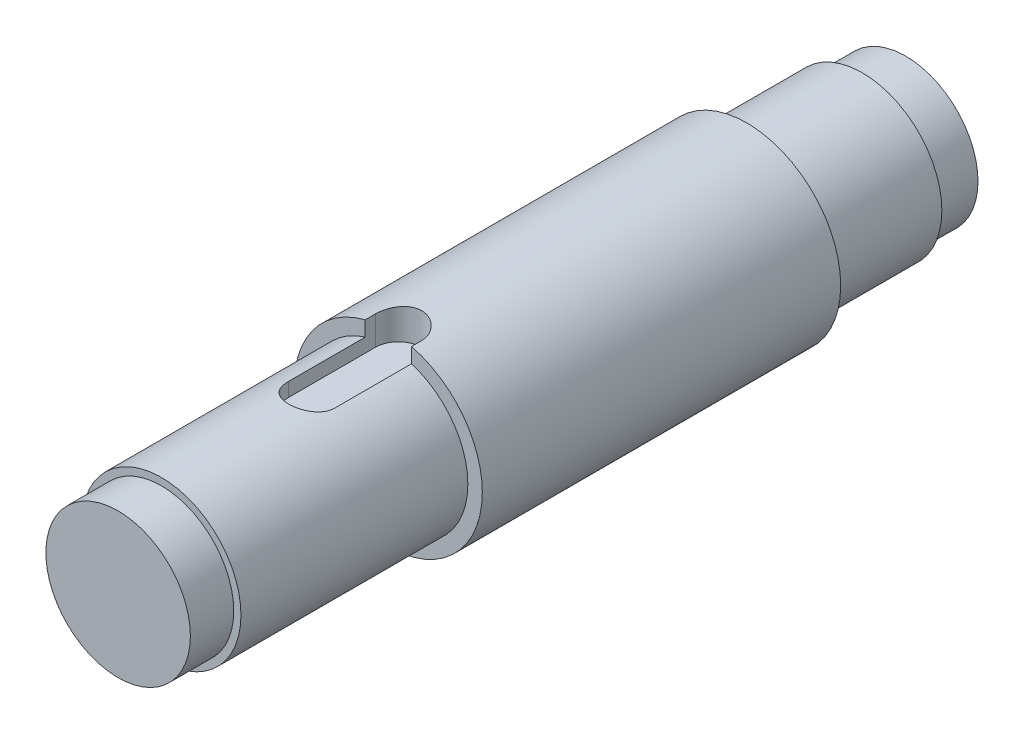
ISO-10303-21;
HEADER;
FILE_DESCRIPTION(('STEP AP214'),'2;1');
FILE_NAME('part.step','',(''),(''),'','','');
FILE_SCHEMA(('AUTOMOTIVE_DESIGN { 1 0 10303 214 1 1 1 1 }'));
ENDSEC;
DATA;
#1=APPLICATION_CONTEXT('core data for automotive mechanical design processes');
#2=APPLICATION_PROTOCOL_DEFINITION('international standard','automotive_design',2000,#1);
#3=PRODUCT_CONTEXT('',#1,'mechanical');
#4=PRODUCT('Part','Part','',(#3));
#5=PRODUCT_RELATED_PRODUCT_CATEGORY('part','',(#4));
#6=PRODUCT_DEFINITION_FORMATION('','',#4);
#7=PRODUCT_DEFINITION_CONTEXT('part definition',#1,'design');
#8=PRODUCT_DEFINITION('design','',#6,#7);
#9=PRODUCT_DEFINITION_SHAPE('','',#8);
#10=(LENGTH_UNIT() NAMED_UNIT(*) SI_UNIT(.MILLI.,.METRE.));
#11=(NAMED_UNIT(*) PLANE_ANGLE_UNIT() SI_UNIT($,.RADIAN.));
#12=(NAMED_UNIT(*) SI_UNIT($,.STERADIAN.) SOLID_ANGLE_UNIT());
#13=UNCERTAINTY_MEASURE_WITH_UNIT(LENGTH_MEASURE(1.E-05),#10,'distance_accuracy_value','');
#14=(GEOMETRIC_REPRESENTATION_CONTEXT(3) GLOBAL_UNCERTAINTY_ASSIGNED_CONTEXT((#13)) GLOBAL_UNIT_ASSIGNED_CONTEXT((#10,
#11,#12)) REPRESENTATION_CONTEXT('',''));
#15=CARTESIAN_POINT('',(0.,0.,0.));
#16=DIRECTION('',(0.,0.,1.));
#17=DIRECTION('',(1.,0.,0.));
#18=AXIS2_PLACEMENT_3D('',#15,#16,#17);
#19=CARTESIAN_POINT('',(0.,21.5,-77.));
#20=DIRECTION('',(0.,1.,0.));
#21=DIRECTION('',(1.,0.,0.));
#22=AXIS2_PLACEMENT_3D('',#19,#20,#21);
#23=PLANE('',#22);
#24=CARTESIAN_POINT('',(0.,21.5,-77.));
#25=DIRECTION('',(0.,1.,0.));
#26=DIRECTION('',(-1.,0.,0.));
#27=AXIS2_PLACEMENT_3D('',#24,#25,#26);
#28=CIRCLE('',#27,8.);
#29=CARTESIAN_POINT('',(-8.,21.5,-77.));
#30=VERTEX_POINT('',#29);
#31=CARTESIAN_POINT('',(8.,21.5,-77.));
#32=VERTEX_POINT('',#31);
#33=EDGE_CURVE('E204',#30,#32,#28,.T.);
#34=ORIENTED_EDGE('',*,*,#33,.T.);
#35=DIRECTION('',(0.,0.,-1.));
#36=VECTOR('',#35,1.);
#37=CARTESIAN_POINT('',(8.,21.5,-77.));
#38=LINE('',#37,#36);
#39=CARTESIAN_POINT('',(8.,21.5,-107.));
#40=VERTEX_POINT('',#39);
#41=EDGE_CURVE('E27',#32,#40,#38,.T.);
#42=ORIENTED_EDGE('',*,*,#41,.T.);
#43=CARTESIAN_POINT('',(0.,21.5,-107.));
#44=DIRECTION('',(0.,1.,0.));
#45=DIRECTION('',(1.,0.,0.));
#46=AXIS2_PLACEMENT_3D('',#43,#44,#45);
#47=CIRCLE('',#46,8.);
#48=CARTESIAN_POINT('',(-8.,21.5,-107.));
#49=VERTEX_POINT('',#48);
#50=EDGE_CURVE('E149',#40,#49,#47,.T.);
#51=ORIENTED_EDGE('',*,*,#50,.T.);
#52=DIRECTION('',(0.,0.,1.));
#53=VECTOR('',#52,1.);
#54=CARTESIAN_POINT('',(-8.,21.5,-107.));
#55=LINE('',#54,#53);
#56=EDGE_CURVE('E11',#49,#30,#55,.T.);
#57=ORIENTED_EDGE('',*,*,#56,.T.);
#58=EDGE_LOOP('',(#34,#42,#51,#57));
#59=FACE_BOUND('',#58,.T.);
#60=ADVANCED_FACE('F17',(#59),#23,.T.);
#61=CARTESIAN_POINT('',(-8.,32.5,-77.));
#62=DIRECTION('',(1.,0.,0.));
#63=DIRECTION('',(0.,1.,0.));
#64=AXIS2_PLACEMENT_3D('',#61,#62,#63);
#65=PLANE('',#64);
#66=DIRECTION('',(0.,-1.,0.));
#67=VECTOR('',#66,1.);
#68=CARTESIAN_POINT('',(-8.,26.310644234,-77.));
#69=LINE('',#68,#67);
#70=CARTESIAN_POINT('',(-8.,26.310644234,-77.));
#71=VERTEX_POINT('',#70);
#72=EDGE_CURVE('E216',#71,#30,#69,.T.);
#73=ORIENTED_EDGE('',*,*,#72,.T.);
#74=ORIENTED_EDGE('',*,*,#56,.F.);
#75=DIRECTION('',(0.,-1.,0.));
#76=VECTOR('',#75,1.);
#77=CARTESIAN_POINT('',(-8.,31.5,-107.));
#78=LINE('',#77,#76);
#79=CARTESIAN_POINT('',(-8.,31.5,-107.));
#80=VERTEX_POINT('',#79);
#81=EDGE_CURVE('E145',#80,#49,#78,.T.);
#82=ORIENTED_EDGE('',*,*,#81,.F.);
#83=DIRECTION('',(0.,0.,-1.));
#84=VECTOR('',#83,1.);
#85=CARTESIAN_POINT('',(-8.,31.5,-103.5));
#86=LINE('',#85,#84);
#87=CARTESIAN_POINT('',(-8.,31.5,-103.5));
#88=VERTEX_POINT('',#87);
#89=EDGE_CURVE('E129',#88,#80,#86,.T.);
#90=ORIENTED_EDGE('',*,*,#89,.F.);
#91=DIRECTION('',(0.,1.,0.));
#92=VECTOR('',#91,1.);
#93=CARTESIAN_POINT('',(-8.,26.310644234,-103.5));
#94=LINE('',#93,#92);
#95=CARTESIAN_POINT('',(-8.,26.310644234,-103.5));
#96=VERTEX_POINT('',#95);
#97=EDGE_CURVE('E205',#96,#88,#94,.T.);
#98=ORIENTED_EDGE('',*,*,#97,.F.);
#99=DIRECTION('',(0.,0.,-1.));
#100=VECTOR('',#99,1.);
#101=CARTESIAN_POINT('',(-8.,26.310644234,-77.));
#102=LINE('',#101,#100);
#103=EDGE_CURVE('E221',#71,#96,#102,.T.);
#104=ORIENTED_EDGE('',*,*,#103,.F.);
#105=EDGE_LOOP('',(#73,#74,#82,#90,#98,#104));
#106=FACE_BOUND('',#105,.T.);
#107=ADVANCED_FACE('F19',(#106),#65,.T.);
#108=CARTESIAN_POINT('',(8.,32.5,-77.));
#109=DIRECTION('',(-1.,0.,0.));
#110=DIRECTION('',(0.,0.,1.));
#111=AXIS2_PLACEMENT_3D('',#108,#109,#110);
#112=PLANE('',#111);
#113=DIRECTION('',(0.,-1.,0.));
#114=VECTOR('',#113,1.);
#115=CARTESIAN_POINT('',(8.,31.5,-103.5));
#116=LINE('',#115,#114);
#117=CARTESIAN_POINT('',(8.,31.5,-103.5));
#118=VERTEX_POINT('',#117);
#119=CARTESIAN_POINT('',(8.,26.310644234,-103.5));
#120=VERTEX_POINT('',#119);
#121=EDGE_CURVE('E401',#118,#120,#116,.T.);
#122=ORIENTED_EDGE('',*,*,#121,.F.);
#123=DIRECTION('',(0.,0.,1.));
#124=VECTOR('',#123,1.);
#125=CARTESIAN_POINT('',(8.,31.5,-107.));
#126=LINE('',#125,#124);
#127=CARTESIAN_POINT('',(8.,31.5,-107.));
#128=VERTEX_POINT('',#127);
#129=EDGE_CURVE('E142',#128,#118,#126,.T.);
#130=ORIENTED_EDGE('',*,*,#129,.F.);
#131=DIRECTION('',(0.,-1.,0.));
#132=VECTOR('',#131,1.);
#133=CARTESIAN_POINT('',(8.,31.5,-107.));
#134=LINE('',#133,#132);
#135=EDGE_CURVE('E154',#128,#40,#134,.T.);
#136=ORIENTED_EDGE('',*,*,#135,.T.);
#137=ORIENTED_EDGE('',*,*,#41,.F.);
#138=DIRECTION('',(0.,-1.,0.));
#139=VECTOR('',#138,1.);
#140=CARTESIAN_POINT('',(8.,26.310644234,-77.));
#141=LINE('',#140,#139);
#142=CARTESIAN_POINT('',(8.,26.310644234,-77.));
#143=VERTEX_POINT('',#142);
#144=EDGE_CURVE('E195',#143,#32,#141,.T.);
#145=ORIENTED_EDGE('',*,*,#144,.F.);
#146=DIRECTION('',(0.,0.,1.));
#147=VECTOR('',#146,1.);
#148=CARTESIAN_POINT('',(8.,26.310644234,-103.5));
#149=LINE('',#148,#147);
#150=EDGE_CURVE('E208',#120,#143,#149,.T.);
#151=ORIENTED_EDGE('',*,*,#150,.F.);
#152=EDGE_LOOP('',(#122,#130,#136,#137,#145,#151));
#153=FACE_BOUND('',#152,.T.);
#154=ADVANCED_FACE('F185',(#153),#112,.T.);
#155=CARTESIAN_POINT('',(0.,24.525030657,-77.));
#156=DIRECTION('',(0.,-1.,0.));
#157=DIRECTION('',(0.,0.,1.));
#158=AXIS2_PLACEMENT_3D('',#155,#156,#157);
#159=CYLINDRICAL_SURFACE('',#158,8.);
#160=ORIENTED_EDGE('',*,*,#144,.T.);
#161=ORIENTED_EDGE('',*,*,#33,.F.);
#162=ORIENTED_EDGE('',*,*,#72,.F.);
#163=CARTESIAN_POINT('',(8.00000000000002,26.3106442338457,-77.));
#164=CARTESIAN_POINT('',(8.00001063663413,26.3106381847652,-76.8679842171772));
#165=CARTESIAN_POINT('',(7.99684836526565,26.311602400651,-76.735962078942));
#166=CARTESIAN_POINT('',(7.98412588473187,26.315467264331,-76.4730867950058));
#167=CARTESIAN_POINT('',(7.97460596108353,26.3183557188287,-76.3422315133879));
#168=CARTESIAN_POINT('',(7.94916539857615,26.3260504965234,-76.0816884283545));
#169=CARTESIAN_POINT('',(7.93326857707538,26.3308496827493,-75.9519980965435));
#170=CARTESIAN_POINT('',(7.89508409444935,26.3423242457405,-75.6937859389041));
#171=CARTESIAN_POINT('',(7.87280322082971,26.3489976297157,-75.5652630208256));
#172=CARTESIAN_POINT('',(7.82185267729796,26.3641674833483,-75.3093836397939));
#173=CARTESIAN_POINT('',(7.7931728044472,26.3726668636691,-75.1820293816585));
#174=CARTESIAN_POINT('',(7.72942322179505,26.3914214220278,-74.9284838681242));
#175=CARTESIAN_POINT('',(7.69432685605237,26.4016839133878,-74.8022998620956));
#176=CARTESIAN_POINT('',(7.6177394361622,26.4238840052899,-74.5510890056893));
#177=CARTESIAN_POINT('',(7.57620628649623,26.4358325828852,-74.4260759728048));
#178=CARTESIAN_POINT('',(7.48673312135404,26.4613115416947,-74.1772019975464));
#179=CARTESIAN_POINT('',(7.43873695599786,26.4748556384292,-74.0533626797647));
#180=CARTESIAN_POINT('',(7.3375020649656,26.5030903452947,-73.8096380847711));
#181=CARTESIAN_POINT('',(7.28432869526921,26.5177662734969,-73.6897239424238));
#182=CARTESIAN_POINT('',(7.17258941254152,26.5482069950423,-73.4533585174904));
#183=CARTESIAN_POINT('',(7.11405346388187,26.563965628082,-73.3368922905684));
#184=CARTESIAN_POINT('',(6.99157509932313,26.5964636673488,-73.1074203914131));
#185=CARTESIAN_POINT('',(6.92764893232057,26.6132000822754,-72.9944056253431));
#186=CARTESIAN_POINT('',(6.79437816247117,26.6475356656652,-72.7718298285192));
#187=CARTESIAN_POINT('',(6.72503627344029,26.6651344003936,-72.6622671060886));
#188=CARTESIAN_POINT('',(6.58092032134516,26.7010676296791,-72.4465878611972));
#189=CARTESIAN_POINT('',(6.50613602843028,26.7194034792223,-72.3404784010441));
#190=CARTESIAN_POINT('',(6.35112092134067,26.7566747599054,-72.1316965646584));
#191=CARTESIAN_POINT('',(6.27086789046788,26.7756124467062,-72.0290410925629));
#192=CARTESIAN_POINT('',(6.10489927065096,26.8139423889927,-71.8271574817154));
#193=CARTESIAN_POINT('',(6.01915073931919,26.8333368374932,-71.7279568550016));
#194=CARTESIAN_POINT('',(5.84217687925693,26.8724254951577,-71.5329713122928));
#195=CARTESIAN_POINT('',(5.75090940186042,26.8921208336358,-71.4372249131285));
#196=CARTESIAN_POINT('',(5.56437426333695,26.9313346085329,-71.2506419884569));
#197=CARTESIAN_POINT('',(5.46912868322527,26.950853437869,-71.1597834697068));
#198=CARTESIAN_POINT('',(5.27501605719578,26.9895150664608,-70.9834415835561));
#199=CARTESIAN_POINT('',(5.17618092432418,27.0086595777221,-70.8979234967874));
#200=CARTESIAN_POINT('',(4.97489261391068,27.0464577221801,-70.7322535421914));
#201=CARTESIAN_POINT('',(4.87246076318082,27.0651133802268,-70.6520762363642));
#202=CARTESIAN_POINT('',(4.66398143467798,27.1018162937609,-70.497078331499));
#203=CARTESIAN_POINT('',(4.55794520267497,27.1198651447031,-70.422242989779));
#204=CARTESIAN_POINT('',(4.34226160703891,27.1552333697058,-70.2779179949582));
#205=CARTESIAN_POINT('',(4.23261622817551,27.1725531331523,-70.2084254715836));
#206=CARTESIAN_POINT('',(4.00972028279601,27.2063388092031,-70.0747736333264));
#207=CARTESIAN_POINT('',(3.89646355971983,27.2228031223439,-70.0106241824715));
#208=CARTESIAN_POINT('',(3.66635118496779,27.2547503594519,-69.8876468900622));
#209=CARTESIAN_POINT('',(3.54948258768897,27.2702289436451,-69.8288421513517));
#210=CARTESIAN_POINT('',(3.31215793991453,27.3000733263599,-69.7165361004515));
#211=CARTESIAN_POINT('',(3.19168369259009,27.314431353955,-69.6630712085703));
#212=CARTESIAN_POINT('',(2.94772352097836,27.3418370817882,-69.5616900662468));
#213=CARTESIAN_POINT('',(2.82422776160261,27.3548795067969,-69.5137960445834));
#214=CARTESIAN_POINT('',(2.57589508061309,27.3793755291168,-69.4244471902627));
#215=CARTESIAN_POINT('',(2.45107678493254,27.3908409993828,-69.3829439214428));
#216=CARTESIAN_POINT('',(2.20012882212519,27.4121359902047,-69.3063594111273));
#217=CARTESIAN_POINT('',(2.07401068206626,27.4219744614564,-69.2712429192529));
#218=CARTESIAN_POINT('',(1.82048958729137,27.439969250332,-69.2074196393167));
#219=CARTESIAN_POINT('',(1.69309227449741,27.448131033754,-69.1786919982495));
#220=CARTESIAN_POINT('',(1.43704034004028,27.462726452072,-69.1276313034055));
#221=CARTESIAN_POINT('',(1.30838691492132,27.4691615915295,-69.1052926812442));
#222=CARTESIAN_POINT('',(1.04984990072052,27.4802580520173,-69.0669944856475));
#223=CARTESIAN_POINT('',(0.919964685970376,27.4849165474191,-69.0510450717901));
#224=CARTESIAN_POINT('',(0.658990711244915,27.4924142365288,-69.0255097887954));
#225=CARTESIAN_POINT('',(0.527899211264715,27.4952460325822,-69.0159497895498));
#226=CARTESIAN_POINT('',(0.264539953406299,27.4990449518927,-69.0031763690027));
#227=CARTESIAN_POINT('',(0.13227004357565,27.5000000003686,-69.0000040420625));
#228=CARTESIAN_POINT('',(-0.132223538185608,27.4999999996315,-68.9999959593586));
#229=CARTESIAN_POINT('',(-0.264447210022186,27.4990456218798,-69.0031579760848));
#230=CARTESIAN_POINT('',(-0.527727231288652,27.4952491762827,-69.0159147896018));
#231=CARTESIAN_POINT('',(-0.658785698905131,27.4924189927068,-69.0254690913019));
#232=CARTESIAN_POINT('',(-0.919706908494964,27.4849250805451,-69.0509943888429));
#233=CARTESIAN_POINT('',(-1.04957232186234,27.4802685615863,-69.0669401591447));
#234=CARTESIAN_POINT('',(-1.30808305849149,27.4691760319991,-69.1052331208101));
#235=CARTESIAN_POINT('',(-1.43672990219033,27.4627426634177,-69.1275708096167));
#236=CARTESIAN_POINT('',(-1.69278199524567,27.4481502022091,-69.1786315452405));
#237=CARTESIAN_POINT('',(-1.82018590707416,27.4399894277477,-69.2073608164219));
#238=CARTESIAN_POINT('',(-2.07373358349817,27.4219955089599,-69.2711891536301));
#239=CARTESIAN_POINT('',(-2.19987153347067,27.4121567293973,-69.3063097110316));
#240=CARTESIAN_POINT('',(-2.45087222711299,27.3908594559666,-69.3829047834501));
#241=CARTESIAN_POINT('',(-2.57572324431716,27.3793918509852,-69.4244151585538));
#242=CARTESIAN_POINT('',(-2.82413537592375,27.3548892528324,-69.5137783505956));
#243=CARTESIAN_POINT('',(-2.9476776549213,27.3418422347952,-69.5616801519377));
#244=CARTESIAN_POINT('',(-3.19164397027297,27.3144358156826,-69.6630455969842));
#245=CARTESIAN_POINT('',(-3.31207962933858,27.3000826505609,-69.7164829656485));
#246=CARTESIAN_POINT('',(-3.54933785343135,27.2702476643357,-69.8287428255175));
#247=CARTESIAN_POINT('',(-3.66617834626435,27.254773489387,-69.8875294270853));
#248=CARTESIAN_POINT('',(-3.89624624686574,27.2228341534532,-70.0104769221425));
#249=CARTESIAN_POINT('',(-4.00948628532429,27.2063732239136,-70.0746152734766));
#250=CARTESIAN_POINT('',(-4.23236032405774,27.1725929716784,-70.2082519937969));
#251=CARTESIAN_POINT('',(-4.34200013094778,27.1552751568492,-70.2777410591345));
#252=CARTESIAN_POINT('',(-4.55768405405259,27.1199090566879,-70.4220660898357));
#253=CARTESIAN_POINT('',(-4.6637258060217,27.1018603075183,-70.496905474214));
#254=CARTESIAN_POINT('',(-4.87222770359141,27.0651554010204,-70.6519183521584));
#255=CARTESIAN_POINT('',(-4.97467620373443,27.0464975902702,-70.7321071122276));
#256=CARTESIAN_POINT('',(-5.17600884799152,27.0086926626371,-70.8978073522901));
#257=CARTESIAN_POINT('',(-5.27487125369105,26.9895434784397,-70.9833447609013));
#258=CARTESIAN_POINT('',(-5.46905105909167,26.9508693299055,-71.159730937759));
#259=CARTESIAN_POINT('',(-5.56433614734319,26.9313426215127,-71.2506148600587));
#260=CARTESIAN_POINT('',(-5.75088197346641,26.8921265995224,-71.4371864333081));
#261=CARTESIAN_POINT('',(-5.84212375428448,26.872436947661,-71.5328929688565));
#262=CARTESIAN_POINT('',(-6.0190529633653,26.8333587122227,-71.7278109250885));
#263=CARTESIAN_POINT('',(-6.1047821055626,26.8139690028888,-71.8269842207254));
#264=CARTESIAN_POINT('',(-6.2707204132232,26.7756469475357,-72.0288235219105));
#265=CARTESIAN_POINT('',(-6.35096202868511,26.7567124389426,-72.1314624257752));
#266=CARTESIAN_POINT('',(-6.50596231316387,26.7194457679815,-72.3402219431414));
#267=CARTESIAN_POINT('',(-6.58074267377459,26.7011114025142,-72.4463260517932));
#268=CARTESIAN_POINT('',(-6.72485883797885,26.6651791602121,-72.6620053161346));
#269=CARTESIAN_POINT('',(-6.79420432095313,26.6475800013694,-72.7715737896418));
#270=CARTESIAN_POINT('',(-6.92749043536345,26.6132413687271,-72.9941718053641));
#271=CARTESIAN_POINT('',(-6.99142779029734,26.5965024184588,-73.1072033900092));
#272=CARTESIAN_POINT('',(-7.11393615601085,26.5639970899434,-73.3367199018307));
#273=CARTESIAN_POINT('',(-7.17249035557963,26.5482338055832,-73.4532142376661));
#274=CARTESIAN_POINT('',(-7.28427562661749,26.5177809067688,-73.6896460194275));
#275=CARTESIAN_POINT('',(-7.33747619690165,26.5030975599933,-73.8095986790872));
#276=CARTESIAN_POINT('',(-7.43873638503454,26.4748557976523,-74.0533381838585));
#277=CARTESIAN_POINT('',(-7.48673367070153,26.4613113826412,-74.1771525651843));
#278=CARTESIAN_POINT('',(-7.57620775557588,26.4358321671343,-74.4259842477038));
#279=CARTESIAN_POINT('',(-7.61774046432223,26.4238837085531,-74.5509800125398));
#280=CARTESIAN_POINT('',(-7.69432767809641,26.401683673822,-74.8021630518274));
#281=CARTESIAN_POINT('',(-7.72942399027709,26.391421195484,-74.9283366022773));
#282=CARTESIAN_POINT('',(-7.79317365310684,26.3726666144623,-75.1818681541174));
#283=CARTESIAN_POINT('',(-7.82185334829659,26.3641672837475,-75.309218990413));
#284=CARTESIAN_POINT('',(-7.87280388552157,26.3489974316325,-75.5650984260851));
#285=CARTESIAN_POINT('',(-7.8950845991815,26.3423240940568,-75.6936248922751));
#286=CARTESIAN_POINT('',(-7.9332690899645,26.3308495286346,-75.9518510772956));
#287=CARTESIAN_POINT('',(-7.94916573708484,26.3260503941435,-76.0815519434142));
#288=CARTESIAN_POINT('',(-7.97460630080088,26.3183556160718,-76.342123032814));
#289=CARTESIAN_POINT('',(-7.98412605498977,26.3154672128684,-76.4729958207518));
#290=CARTESIAN_POINT('',(-7.99684852895893,26.3116023506634,-76.7359131081469));
#291=CARTESIAN_POINT('',(-8.00001062518916,26.3106381872704,-76.8679597611673));
#292=CARTESIAN_POINT('',(-7.99999999999998,26.3106442338457,-77.));
#293=B_SPLINE_CURVE_WITH_KNOTS('',3,(#163,#164,#165,#166,#167,#168,#169,#170,#171,#172,#173,
#174,#175,#176,#177,#178,#179,#180,#181,#182,#183,#184,#185,#186,#187,#188,#189,#190,#191,#192,
#193,#194,#195,#196,#197,#198,#199,#200,#201,#202,#203,#204,#205,#206,#207,#208,#209,#210,#211,
#212,#213,#214,#215,#216,#217,#218,#219,#220,#221,#222,#223,#224,#225,#226,#227,#228,#229,#230,
#231,#232,#233,#234,#235,#236,#237,#238,#239,#240,#241,#242,#243,#244,#245,#246,#247,#248,#249,
#250,#251,#252,#253,#254,#255,#256,#257,#258,#259,#260,#261,#262,#263,#264,#265,#266,#267,#268,
#269,#270,#271,#272,#273,#274,#275,#276,#277,#278,#279,#280,#281,#282,#283,#284,#285,#286,#287,
#288,#289,#290,#291,#292),.UNSPECIFIED.,.F.,.F.,(4,2,2,2,2,2,2,2,2,2,2,2,2,2,2,2,2,2,2,2,2,2,2,
2,2,2,2,2,2,2,2,2,2,2,2,2,2,2,2,2,2,2,2,2,2,2,2,2,2,2,2,2,2,2,2,2,2,2,2,2,2,2,2,2,4),(0.,
0.396014742084964,0.789543634083339,1.18161620256454,1.57327345765968,1.96555971427108,
2.35951428304803,2.75616335815849,3.15651241111315,3.55233837918194,3.9460737642686,
4.33866198261833,4.73105472204367,5.12420508689602,5.51906069202452,5.91655695331917,
6.31761080625652,6.71667585901527,7.11279588033356,7.50686968863187,7.89981014307139,
8.29253800484552,8.68597552653308,9.08103998953693,9.4786374137914,9.87777052565646,
10.2737114262033,10.6673959119285,11.0597759237415,11.4518129051515,11.8444708194058,
12.2387090749422,12.6354756161926,13.0321026565985,13.4262405627162,13.8188379847772,
14.2108547567817,14.6032549737176,14.9969999140094,15.3930410644411,15.7923134962229,
16.189770771585,16.5847344053294,16.9781111305615,17.3708186739829,17.7637794520109,
18.1579141042821,18.5541350889981,18.9533405596218,19.354253587351,19.7516485865246,
20.1464431656349,20.539573146332,20.9319862630907,21.3246354445529,21.718471908831,
22.1144383203719,22.5147191971725,22.9113186576437,23.3052429743077,23.697519010376,
24.0891865961853,24.4812904049244,24.8748716378182,25.270959846155),.UNSPECIFIED.);
#294=EDGE_CURVE('E212',#143,#71,#293,.T.);
#295=ORIENTED_EDGE('',*,*,#294,.F.);
#296=EDGE_LOOP('',(#160,#161,#162,#295));
#297=FACE_BOUND('',#296,.T.);
#298=ADVANCED_FACE('F180',(#297),#159,.F.);
#299=CARTESIAN_POINT('',(0.,25.,-282.5));
#300=DIRECTION('',(0.,0.,-1.));
#301=DIRECTION('',(0.,-1.,0.));
#302=AXIS2_PLACEMENT_3D('',#299,#300,#301);
#303=PLANE('',#302);
#304=CARTESIAN_POINT('',(0.,0.,-282.5));
#305=DIRECTION('',(0.,0.,-1.));
#306=DIRECTION('',(-1.,0.,0.));
#307=AXIS2_PLACEMENT_3D('',#304,#305,#306);
#308=CIRCLE('',#307,25.);
#309=CARTESIAN_POINT('',(25.,0.,-282.5));
#310=VERTEX_POINT('',#309);
#311=EDGE_CURVE('E419',#310,#310,#308,.T.);
#312=ORIENTED_EDGE('',*,*,#311,.T.);
#313=EDGE_LOOP('',(#312));
#314=FACE_BOUND('',#313,.T.);
#315=ADVANCED_FACE('F184',(#314),#303,.T.);
#316=CARTESIAN_POINT('',(0.,25.,-267.5));
#317=DIRECTION('',(0.,0.,-1.));
#318=DIRECTION('',(0.,-1.,0.));
#319=AXIS2_PLACEMENT_3D('',#316,#317,#318);
#320=PLANE('',#319);
#321=CARTESIAN_POINT('',(0.,0.,-267.5));
#322=DIRECTION('',(0.,0.,-1.));
#323=DIRECTION('',(-1.,0.,0.));
#324=AXIS2_PLACEMENT_3D('',#321,#322,#323);
#325=CIRCLE('',#324,25.);
#326=CARTESIAN_POINT('',(25.,0.,-267.5));
#327=VERTEX_POINT('',#326);
#328=EDGE_CURVE('E431',#327,#327,#325,.T.);
#329=ORIENTED_EDGE('',*,*,#328,.F.);
#330=EDGE_LOOP('',(#329));
#331=FACE_BOUND('',#330,.T.);
#332=CARTESIAN_POINT('',(0.,0.,-267.5));
#333=DIRECTION('',(0.,0.,-1.));
#334=DIRECTION('',(-1.,0.,0.));
#335=AXIS2_PLACEMENT_3D('',#332,#333,#334);
#336=CIRCLE('',#335,27.5);
#337=CARTESIAN_POINT('',(27.5,0.,-267.5));
#338=VERTEX_POINT('',#337);
#339=EDGE_CURVE('E434',#338,#338,#336,.T.);
#340=ORIENTED_EDGE('',*,*,#339,.T.);
#341=EDGE_LOOP('',(#340));
#342=FACE_BOUND('',#341,.T.);
#343=ADVANCED_FACE('F264',(#331,#342),#320,.T.);
#344=CARTESIAN_POINT('',(0.,32.5,-227.5));
#345=DIRECTION('',(0.,0.,-1.));
#346=DIRECTION('',(0.,-1.,0.));
#347=AXIS2_PLACEMENT_3D('',#344,#345,#346);
#348=PLANE('',#347);
#349=CARTESIAN_POINT('',(0.,0.,-227.5));
#350=DIRECTION('',(0.,0.,-1.));
#351=DIRECTION('',(-1.,0.,0.));
#352=AXIS2_PLACEMENT_3D('',#349,#350,#351);
#353=CIRCLE('',#352,27.5);
#354=CARTESIAN_POINT('',(27.5,0.,-227.5));
#355=VERTEX_POINT('',#354);
#356=EDGE_CURVE('E425',#355,#355,#353,.T.);
#357=ORIENTED_EDGE('',*,*,#356,.F.);
#358=EDGE_LOOP('',(#357));
#359=FACE_BOUND('',#358,.T.);
#360=CARTESIAN_POINT('',(0.,0.,-227.5));
#361=DIRECTION('',(0.,0.,-1.));
#362=DIRECTION('',(-1.,0.,0.));
#363=AXIS2_PLACEMENT_3D('',#360,#361,#362);
#364=CIRCLE('',#363,32.5);
#365=CARTESIAN_POINT('',(32.5,0.,-227.5));
#366=VERTEX_POINT('',#365);
#367=EDGE_CURVE('E451',#366,#366,#364,.T.);
#368=ORIENTED_EDGE('',*,*,#367,.T.);
#369=EDGE_LOOP('',(#368));
#370=FACE_BOUND('',#369,.T.);
#371=ADVANCED_FACE('F267',(#359,#370),#348,.T.);
#372=CARTESIAN_POINT('',(0.,27.5,-25.));
#373=DIRECTION('',(0.,0.,1.));
#374=DIRECTION('',(1.,0.,0.));
#375=AXIS2_PLACEMENT_3D('',#372,#373,#374);
#376=PLANE('',#375);
#377=CARTESIAN_POINT('',(0.,0.,-25.));
#378=DIRECTION('',(0.,0.,-1.));
#379=DIRECTION('',(-1.,0.,0.));
#380=AXIS2_PLACEMENT_3D('',#377,#378,#379);
#381=CIRCLE('',#380,25.);
#382=CARTESIAN_POINT('',(25.,0.,-25.));
#383=VERTEX_POINT('',#382);
#384=EDGE_CURVE('E396',#383,#383,#381,.T.);
#385=ORIENTED_EDGE('',*,*,#384,.T.);
#386=EDGE_LOOP('',(#385));
#387=FACE_BOUND('',#386,.T.);
#388=CARTESIAN_POINT('',(0.,0.,-25.));
#389=DIRECTION('',(0.,0.,-1.));
#390=DIRECTION('',(-1.,0.,0.));
#391=AXIS2_PLACEMENT_3D('',#388,#389,#390);
#392=CIRCLE('',#391,27.5);
#393=CARTESIAN_POINT('',(27.5,0.,-25.));
#394=VERTEX_POINT('',#393);
#395=EDGE_CURVE('E398',#394,#394,#392,.T.);
#396=ORIENTED_EDGE('',*,*,#395,.F.);
#397=EDGE_LOOP('',(#396));
#398=FACE_BOUND('',#397,.T.);
#399=ADVANCED_FACE('F175',(#387,#398),#376,.T.);
#400=CARTESIAN_POINT('',(0.,0.,-10.));
#401=DIRECTION('',(0.,0.,1.));
#402=DIRECTION('',(1.,0.,0.));
#403=AXIS2_PLACEMENT_3D('',#400,#401,#402);
#404=PLANE('',#403);
#405=CARTESIAN_POINT('',(0.,0.,-10.));
#406=DIRECTION('',(0.,0.,-1.));
#407=DIRECTION('',(-1.,0.,0.));
#408=AXIS2_PLACEMENT_3D('',#405,#406,#407);
#409=CIRCLE('',#408,25.);
#410=CARTESIAN_POINT('',(25.,0.,-9.99999999999983));
#411=VERTEX_POINT('',#410);
#412=EDGE_CURVE('E430',#411,#411,#409,.T.);
#413=ORIENTED_EDGE('',*,*,#412,.F.);
#414=EDGE_LOOP('',(#413));
#415=FACE_BOUND('',#414,.T.);
#416=ADVANCED_FACE('F260',(#415),#404,.T.);
#417=CARTESIAN_POINT('',(0.,27.5,-103.5));
#418=DIRECTION('',(0.,0.,1.));
#419=DIRECTION('',(1.,0.,0.));
#420=AXIS2_PLACEMENT_3D('',#417,#418,#419);
#421=PLANE('',#420);
#422=CARTESIAN_POINT('',(0.,0.,-103.5));
#423=DIRECTION('',(0.,0.,-1.));
#424=DIRECTION('',(-1.,0.,0.));
#425=AXIS2_PLACEMENT_3D('',#422,#423,#424);
#426=CIRCLE('',#425,32.5);
#427=CARTESIAN_POINT('',(32.5,0.,-103.5));
#428=VERTEX_POINT('',#427);
#429=EDGE_CURVE('E458',#118,#428,#426,.T.);
#430=ORIENTED_EDGE('',*,*,#429,.F.);
#431=ORIENTED_EDGE('',*,*,#121,.T.);
#432=CARTESIAN_POINT('',(0.,0.,-103.5));
#433=DIRECTION('',(0.,0.,-1.));
#434=DIRECTION('',(-1.,0.,0.));
#435=AXIS2_PLACEMENT_3D('',#432,#433,#434);
#436=CIRCLE('',#435,27.5);
#437=CARTESIAN_POINT('',(27.5,0.,-103.5));
#438=VERTEX_POINT('',#437);
#439=EDGE_CURVE('E213',#120,#438,#436,.T.);
#440=ORIENTED_EDGE('',*,*,#439,.T.);
#441=CARTESIAN_POINT('',(0.,0.,-103.5));
#442=DIRECTION('',(0.,0.,-1.));
#443=DIRECTION('',(-1.,0.,0.));
#444=AXIS2_PLACEMENT_3D('',#441,#442,#443);
#445=CIRCLE('',#444,27.5);
#446=EDGE_CURVE('E225',#438,#96,#445,.T.);
#447=ORIENTED_EDGE('',*,*,#446,.T.);
#448=ORIENTED_EDGE('',*,*,#97,.T.);
#449=CARTESIAN_POINT('',(0.,0.,-103.5));
#450=DIRECTION('',(0.,0.,-1.));
#451=DIRECTION('',(-1.,0.,0.));
#452=AXIS2_PLACEMENT_3D('',#449,#450,#451);
#453=CIRCLE('',#452,32.5);
#454=EDGE_CURVE('E139',#428,#88,#453,.T.);
#455=ORIENTED_EDGE('',*,*,#454,.F.);
#456=EDGE_LOOP('',(#430,#431,#440,#447,#448,#455));
#457=FACE_BOUND('',#456,.T.);
#458=ADVANCED_FACE('F259',(#457),#421,.T.);
#459=CARTESIAN_POINT('',(0.,0.,-59.25));
#460=DIRECTION('',(0.,0.,-1.));
#461=DIRECTION('',(-1.,0.,0.));
#462=AXIS2_PLACEMENT_3D('',#459,#460,#461);
#463=CYLINDRICAL_SURFACE('',#462,27.5);
#464=ORIENTED_EDGE('',*,*,#439,.F.);
#465=ORIENTED_EDGE('',*,*,#150,.T.);
#466=ORIENTED_EDGE('',*,*,#294,.T.);
#467=ORIENTED_EDGE('',*,*,#103,.T.);
#468=ORIENTED_EDGE('',*,*,#446,.F.);
#469=DIRECTION('',(0.,0.,1.));
#470=VECTOR('',#469,1.);
#471=CARTESIAN_POINT('',(27.5,0.,-59.25));
#472=LINE('',#471,#470);
#473=EDGE_CURVE('E235',#438,#394,#472,.T.);
#474=ORIENTED_EDGE('',*,*,#473,.T.);
#475=ORIENTED_EDGE('',*,*,#395,.T.);
#476=ORIENTED_EDGE('',*,*,#473,.F.);
#477=EDGE_LOOP('',(#464,#465,#466,#467,#468,#474,#475,#476));
#478=FACE_BOUND('',#477,.T.);
#479=ADVANCED_FACE('F243',(#478),#463,.T.);
#480=CARTESIAN_POINT('',(0.,0.,-165.5));
#481=DIRECTION('',(0.,0.,-1.));
#482=DIRECTION('',(-1.,0.,0.));
#483=AXIS2_PLACEMENT_3D('',#480,#481,#482);
#484=CYLINDRICAL_SURFACE('',#483,32.5);
#485=ORIENTED_EDGE('',*,*,#367,.F.);
#486=DIRECTION('',(0.,0.,1.));
#487=VECTOR('',#486,1.);
#488=CARTESIAN_POINT('',(32.5,0.,-165.5));
#489=LINE('',#488,#487);
#490=EDGE_CURVE('E455',#366,#428,#489,.T.);
#491=ORIENTED_EDGE('',*,*,#490,.T.);
#492=ORIENTED_EDGE('',*,*,#454,.T.);
#493=ORIENTED_EDGE('',*,*,#89,.T.);
#494=CARTESIAN_POINT('',(-7.99999999999999,31.5,-107.));
#495=CARTESIAN_POINT('',(-8.000010502938,31.4999950389591,-107.132022992117));
#496=CARTESIAN_POINT('',(-7.99685046102307,31.5007997862529,-107.264052504417));
#497=CARTESIAN_POINT('',(-7.98413409363701,31.5040264745672,-107.526914235586));
#498=CARTESIAN_POINT('',(-7.97461984881911,31.5064377759469,-107.657748628236));
#499=CARTESIAN_POINT('',(-7.94919387676282,31.512862097348,-107.918221696444));
#500=CARTESIAN_POINT('',(-7.93330822018354,31.5168685896561,-108.047863068745));
#501=CARTESIAN_POINT('',(-7.89515195739632,31.5264486485754,-108.305948889633));
#502=CARTESIAN_POINT('',(-7.87289080569043,31.53201989451,-108.434394821903));
#503=CARTESIAN_POINT('',(-7.8219895321716,31.544685244379,-108.690091573088));
#504=CARTESIAN_POINT('',(-7.79334223250689,31.5517810615616,-108.817340877973));
#505=CARTESIAN_POINT('',(-7.7296728531172,31.5674394870335,-109.070647540192));
#506=CARTESIAN_POINT('',(-7.69462743167695,31.5760074590907,-109.196698694234));
#507=CARTESIAN_POINT('',(-7.61816298317179,31.5945430353127,-109.447614426031));
#508=CARTESIAN_POINT('',(-7.5767053872854,31.604519074866,-109.572466615955));
#509=CARTESIAN_POINT('',(-7.48741288045218,31.6257928090265,-109.82098952051));
#510=CARTESIAN_POINT('',(-7.43952549748568,31.6371012727862,-109.944640430679));
#511=CARTESIAN_POINT('',(-7.3383433450945,31.6607232757666,-110.188433169496));
#512=CARTESIAN_POINT('',(-7.28509530160923,31.673027973394,-110.308595256247));
#513=CARTESIAN_POINT('',(-7.17319459970019,31.6985575619574,-110.545413403879));
#514=CARTESIAN_POINT('',(-7.11457529772631,31.7117766632876,-110.662085833878));
#515=CARTESIAN_POINT('',(-6.99192675787524,31.739043660856,-110.891927276509));
#516=CARTESIAN_POINT('',(-6.927917013822,31.7530885195503,-111.005107048343));
#517=CARTESIAN_POINT('',(-6.79448325413581,31.7819075919883,-111.227969608633));
#518=CARTESIAN_POINT('',(-6.72506501284176,31.7966810218558,-111.337655955172));
#519=CARTESIAN_POINT('',(-6.58080872043555,31.8268501926398,-111.553539057673));
#520=CARTESIAN_POINT('',(-6.50596328488177,31.8422467683599,-111.659730762046));
#521=CARTESIAN_POINT('',(-6.35084644346965,31.8735475348691,-111.86863354158));
#522=CARTESIAN_POINT('',(-6.27055543479479,31.8894534374861,-111.971329799623));
#523=CARTESIAN_POINT('',(-6.10453964894063,31.9216507837514,-112.173251448863));
#524=CARTESIAN_POINT('',(-6.01878431140109,31.9379440045218,-112.272451418582));
#525=CARTESIAN_POINT('',(-5.84183343621234,31.9707858152755,-112.467391885281));
#526=CARTESIAN_POINT('',(-5.75059790998227,31.9873353990194,-112.563095883538));
#527=CARTESIAN_POINT('',(-5.56401032271462,32.0203175857176,-112.749712798825));
#528=CARTESIAN_POINT('',(-5.46867457462104,32.0367503951083,-112.840641989949));
#529=CARTESIAN_POINT('',(-5.27437693622292,32.0693089503642,-113.01711462041));
#530=CARTESIAN_POINT('',(-5.17544665636062,32.0854360628777,-113.102692577941));
#531=CARTESIAN_POINT('',(-4.97396589074073,32.1172852596668,-113.268471648212));
#532=CARTESIAN_POINT('',(-4.8714362545731,32.1330089803882,-113.348697775098));
#533=CARTESIAN_POINT('',(-4.66276141373715,32.1639510948087,-113.503782982253));
#534=CARTESIAN_POINT('',(-4.55662685291206,32.1791707517872,-113.5786561275));
#535=CARTESIAN_POINT('',(-4.34074817813604,32.2090014350288,-113.723046654822));
#536=CARTESIAN_POINT('',(-4.23100537983491,32.2236126788246,-113.792565958799));
#537=CARTESIAN_POINT('',(-4.00791696358581,32.2521204202822,-113.926261477791));
#538=CARTESIAN_POINT('',(-3.89456451051604,32.2660154132584,-113.990426606805));
#539=CARTESIAN_POINT('',(-3.66426322759553,32.2929818177794,-114.11342595074));
#540=CARTESIAN_POINT('',(-3.54730081790937,32.3060493546338,-114.172235580073));
#541=CARTESIAN_POINT('',(-3.30978982462259,32.3312487675544,-114.284541211229));
#542=CARTESIAN_POINT('',(-3.18922249604222,32.3433738056467,-114.337999068222));
#543=CARTESIAN_POINT('',(-2.94526629044792,32.3665021597067,-114.439282399641));
#544=CARTESIAN_POINT('',(-2.82187086662164,32.3775024632809,-114.487092798904));
#545=CARTESIAN_POINT('',(-2.57375376599311,32.3981660844583,-114.57628766461));
#546=CARTESIAN_POINT('',(-2.44904982124869,32.4078391181714,-114.617719134374));
#547=CARTESIAN_POINT('',(-2.19833932323712,32.4258078146836,-114.69417223254));
#548=CARTESIAN_POINT('',(-2.07234357474638,32.4341106975772,-114.729227567409));
#549=CARTESIAN_POINT('',(-1.81907006184908,32.4492993551053,-114.792941150081));
#550=CARTESIAN_POINT('',(-1.69179738976774,32.4561893814115,-114.821618613346));
#551=CARTESIAN_POINT('',(-1.43599106786098,32.4685126923824,-114.872591564928));
#552=CARTESIAN_POINT('',(-1.30745823309974,32.4739468615714,-114.8948909289));
#553=CARTESIAN_POINT('',(-1.04915194990831,32.4833190022394,-114.933123283988));
#554=CARTESIAN_POINT('',(-0.91937664471824,32.4872541841242,-114.94904440811));
#555=CARTESIAN_POINT('',(-0.658604894459495,32.4935889511655,-114.974535781602));
#556=CARTESIAN_POINT('',(-0.527605598907712,32.4959818734026,-114.984078481189));
#557=CARTESIAN_POINT('',(-0.264405701275146,32.4991927080511,-114.996829927596));
#558=CARTESIAN_POINT('',(-0.132202917345241,32.5000000003121,-114.999995968727));
#559=CARTESIAN_POINT('',(0.132156451979338,32.4999999996881,-115.000004029856));
#560=CARTESIAN_POINT('',(0.264313037280244,32.4991932741817,-114.996848272166));
#561=CARTESIAN_POINT('',(0.527433757869523,32.4959845297341,-114.984113389114));
#562=CARTESIAN_POINT('',(0.658400042123747,32.4935929698455,-114.974576372644));
#563=CARTESIAN_POINT('',(0.919119047327344,32.4872613937204,-114.949094959034));
#564=CARTESIAN_POINT('',(1.0488745518878,32.4833278814767,-114.933177468608));
#565=CARTESIAN_POINT('',(1.30715453864908,32.4739590613664,-114.894950333826));
#566=CARTESIAN_POINT('',(1.43568077483897,32.4685263879883,-114.872651900234));
#567=CARTESIAN_POINT('',(1.69148720695072,32.4562055746665,-114.821678907935));
#568=CARTESIAN_POINT('',(1.81876644984476,32.4493164004841,-114.792999817661));
#569=CARTESIAN_POINT('',(2.07206648498857,32.4341284775361,-114.729281191287));
#570=CARTESIAN_POINT('',(2.19808201561667,32.4258253340683,-114.694221800765));
#571=CARTESIAN_POINT('',(2.44884519987888,32.4078547091535,-114.617758166611));
#572=CARTESIAN_POINT('',(2.57358185305874,32.3981798722649,-114.576319605803));
#573=CARTESIAN_POINT('',(2.82177841215984,32.3775106961362,-114.487110444849));
#574=CARTESIAN_POINT('',(2.94522038030442,32.366506512711,-114.439292291351));
#575=CARTESIAN_POINT('',(3.18918283518824,32.3433775652326,-114.338024672738));
#576=CARTESIAN_POINT('',(3.30971162767771,32.3312566241116,-114.28459433751));
#577=CARTESIAN_POINT('',(3.54715624554368,32.306065130158,-114.172334890742));
#578=CARTESIAN_POINT('',(3.66409055143692,32.293001309985,-114.113543393229));
#579=CARTESIAN_POINT('',(3.89434732513551,32.2660415663358,-113.990573839765));
#580=CARTESIAN_POINT('',(4.00768306164609,32.2521494262664,-113.926419807275));
#581=CARTESIAN_POINT('',(4.23074948669182,32.2236462585454,-113.792739403213));
#582=CARTESIAN_POINT('',(4.3404866635254,32.2090366585721,-113.723223555396));
#583=CARTESIAN_POINT('',(4.5563655650562,32.1792077687003,-113.57883299213));
#584=CARTESIAN_POINT('',(4.66250559695859,32.1639881989093,-113.503955803874));
#585=CARTESIAN_POINT('',(4.87120292984257,32.1330444061981,-113.348855627132));
#586=CARTESIAN_POINT('',(4.97374918887448,32.1173188717281,-113.268618047678));
#587=CARTESIAN_POINT('',(5.17527427100458,32.0854639581039,-113.102808697918));
#588=CARTESIAN_POINT('',(5.27423183391974,32.0693329074639,-113.017211420977));
#589=CARTESIAN_POINT('',(5.46859675573355,32.0367637953828,-112.840694512202));
#590=CARTESIAN_POINT('',(5.56397210652367,32.0203243411431,-112.749739925998));
#591=CARTESIAN_POINT('',(5.75057058479964,31.9873402290256,-112.563134341032));
#592=CARTESIAN_POINT('',(5.84178052229445,31.9707954036775,-112.467470181616));
#593=CARTESIAN_POINT('',(6.01868688725747,31.9379623165683,-112.272597258957));
#594=CARTESIAN_POINT('',(6.10442286760876,31.9216730654439,-112.17342460153));
#595=CARTESIAN_POINT('',(6.27040837008066,31.889482323692,-111.971547232252));
#596=CARTESIAN_POINT('',(6.35068795924837,31.8735790828213,-111.868867532196));
#597=CARTESIAN_POINT('',(6.50578994389844,31.8422821763927,-111.659987057151));
#598=CARTESIAN_POINT('',(6.58063141568456,31.826886844434,-111.553800701492));
#599=CARTESIAN_POINT('',(6.7248878475342,31.79671850093,-111.337917579404));
#600=CARTESIAN_POINT('',(6.79430964023118,31.7819447170008,-111.22822548701));
#601=CARTESIAN_POINT('',(6.92775866301934,31.7531230919612,-111.005340721497));
#602=CARTESIAN_POINT('',(6.99177955513295,31.7390761110276,-110.892144142977));
#603=CARTESIAN_POINT('',(7.11445802840234,31.7118030104772,-110.662258117753));
#604=CARTESIAN_POINT('',(7.1730955527843,31.6985800152109,-110.545557600955));
#605=CARTESIAN_POINT('',(7.2850422208066,31.6730402280572,-110.308673132712));
#606=CARTESIAN_POINT('',(7.33831747231592,31.6607293160367,-110.188472547314));
#607=CARTESIAN_POINT('',(7.43952492705565,31.6371014059522,-109.944664940843));
#608=CARTESIAN_POINT('',(7.48741343392297,31.6257926750193,-109.821038970561));
#609=CARTESIAN_POINT('',(7.57670686456741,31.6045187250327,-109.572558374677));
#610=CARTESIAN_POINT('',(7.61816401610597,31.594542785982,-109.44772346528));
#611=CARTESIAN_POINT('',(7.69462825664426,31.5760072580582,-109.196835567976));
#612=CARTESIAN_POINT('',(7.72967362368521,31.5674392971454,-109.07079487554));
#613=CARTESIAN_POINT('',(7.79334308334119,31.5517808526913,-108.817502182982));
#614=CARTESIAN_POINT('',(7.82199020420389,31.5446850773111,-108.690256303196));
#615=CARTESIAN_POINT('',(7.87289147108567,31.5320197287969,-108.43455949849));
#616=CARTESIAN_POINT('',(7.89515246229657,31.5264485217996,-108.306110017408));
#617=CARTESIAN_POINT('',(7.93330873316731,31.5168684608674,-108.048010162642));
#618=CARTESIAN_POINT('',(7.9491942150915,31.5128620118683,-107.918358251517));
#619=CARTESIAN_POINT('',(7.97462018838933,31.5064376901434,-107.657857164729));
#620=CARTESIAN_POINT('',(7.98413426384698,31.504026431588,-107.527005257003));
#621=CARTESIAN_POINT('',(7.99685062446177,31.5007997445698,-107.264101501007));
#622=CARTESIAN_POINT('',(8.0000104910671,31.4999950411809,-107.132047461784));
#623=CARTESIAN_POINT('',(8.00000000000001,31.5,-107.));
#624=B_SPLINE_CURVE_WITH_KNOTS('',3,(#494,#495,#496,#497,#498,#499,#500,#501,#502,#503,#504,
#505,#506,#507,#508,#509,#510,#511,#512,#513,#514,#515,#516,#517,#518,#519,#520,#521,#522,#523,
#524,#525,#526,#527,#528,#529,#530,#531,#532,#533,#534,#535,#536,#537,#538,#539,#540,#541,#542,
#543,#544,#545,#546,#547,#548,#549,#550,#551,#552,#553,#554,#555,#556,#557,#558,#559,#560,#561,
#562,#563,#564,#565,#566,#567,#568,#569,#570,#571,#572,#573,#574,#575,#576,#577,#578,#579,#580,
#581,#582,#583,#584,#585,#586,#587,#588,#589,#590,#591,#592,#593,#594,#595,#596,#597,#598,#599,
#600,#601,#602,#603,#604,#605,#606,#607,#608,#609,#610,#611,#612,#613,#614,#615,#616,#617,#618,
#619,#620,#621,#622,#623),.UNSPECIFIED.,.F.,.F.,(4,2,2,2,2,2,2,2,2,2,2,2,2,2,2,2,2,2,2,2,2,2,2,
2,2,2,2,2,2,2,2,2,2,2,2,2,2,2,2,2,2,2,2,2,2,2,2,2,2,2,2,2,2,2,2,2,2,2,2,2,2,2,2,2,4),(0.,
0.396037760378115,0.7894784330459,1.18132537943311,1.57259422119099,1.96430507561431,
2.35747461803674,2.75310827682041,3.15219285481977,3.54805877889403,3.94161432777535,
4.33380318905143,4.72557892446824,5.11789810604856,5.51171334346642,5.90796645434116,
6.30758201725786,6.70573296008977,7.10097270794162,7.49421268149298,7.88637824368081,
8.27840236500472,8.67121902286507,9.06575656533055,9.46293127262424,9.86114331032095,
10.256264023878,10.6492311008083,11.0409976929807,11.4325257198484,11.8247788559228,
12.2187154542747,12.6152816632134,13.0117084910073,13.4055448280314,13.7977375258599,
14.1892453615862,14.5810321403421,14.9740596151834,15.369280481767,15.7676316989712,
16.1646666276319,16.5591035982165,16.9518596109593,17.3438634638313,17.7360492996913,
18.1293499655873,18.5246904178299,18.9229814027397,19.322456712189,19.7186089618548,
20.1123634106278,20.5046622864447,20.8964583213482,21.2887079137349,21.6823641583456,
22.0783699955292,22.4773862505356,22.8729702057012,23.2661094518353,23.6578100738119,
24.0490892557486,24.4409674649708,24.8344605094383,25.2305717745221),.UNSPECIFIED.);
#625=EDGE_CURVE('E135',#80,#128,#624,.T.);
#626=ORIENTED_EDGE('',*,*,#625,.T.);
#627=ORIENTED_EDGE('',*,*,#129,.T.);
#628=ORIENTED_EDGE('',*,*,#429,.T.);
#629=ORIENTED_EDGE('',*,*,#490,.F.);
#630=EDGE_LOOP('',(#485,#491,#492,#493,#626,#627,#628,#629));
#631=FACE_BOUND('',#630,.T.);
#632=ADVANCED_FACE('F132',(#631),#484,.T.);
#633=CARTESIAN_POINT('',(0.,0.,-7.5));
#634=DIRECTION('',(0.,0.,-1.));
#635=DIRECTION('',(-1.,0.,0.));
#636=AXIS2_PLACEMENT_3D('',#633,#634,#635);
#637=CYLINDRICAL_SURFACE('',#636,25.);
#638=ORIENTED_EDGE('',*,*,#384,.F.);
#639=DIRECTION('',(0.,0.,1.));
#640=VECTOR('',#639,1.);
#641=CARTESIAN_POINT('',(25.,0.,-7.5));
#642=LINE('',#641,#640);
#643=EDGE_CURVE('E427',#383,#411,#642,.T.);
#644=ORIENTED_EDGE('',*,*,#643,.T.);
#645=ORIENTED_EDGE('',*,*,#412,.T.);
#646=ORIENTED_EDGE('',*,*,#643,.F.);
#647=EDGE_LOOP('',(#638,#644,#645,#646));
#648=FACE_BOUND('',#647,.T.);
#649=ADVANCED_FACE('F283',(#648),#637,.T.);
#650=CARTESIAN_POINT('',(0.,0.,-252.5));
#651=DIRECTION('',(0.,0.,-1.));
#652=DIRECTION('',(-1.,0.,0.));
#653=AXIS2_PLACEMENT_3D('',#650,#651,#652);
#654=CYLINDRICAL_SURFACE('',#653,27.5);
#655=ORIENTED_EDGE('',*,*,#339,.F.);
#656=DIRECTION('',(0.,0.,1.));
#657=VECTOR('',#656,1.);
#658=CARTESIAN_POINT('',(27.5,0.,-252.5));
#659=LINE('',#658,#657);
#660=EDGE_CURVE('E442',#338,#355,#659,.T.);
#661=ORIENTED_EDGE('',*,*,#660,.T.);
#662=ORIENTED_EDGE('',*,*,#356,.T.);
#663=ORIENTED_EDGE('',*,*,#660,.F.);
#664=EDGE_LOOP('',(#655,#661,#662,#663));
#665=FACE_BOUND('',#664,.T.);
#666=ADVANCED_FACE('F178',(#665),#654,.T.);
#667=CARTESIAN_POINT('',(0.,0.,-285.));
#668=DIRECTION('',(0.,0.,-1.));
#669=DIRECTION('',(-1.,0.,0.));
#670=AXIS2_PLACEMENT_3D('',#667,#668,#669);
#671=CYLINDRICAL_SURFACE('',#670,25.);
#672=ORIENTED_EDGE('',*,*,#311,.F.);
#673=DIRECTION('',(0.,0.,1.));
#674=VECTOR('',#673,1.);
#675=CARTESIAN_POINT('',(25.,0.,-285.));
#676=LINE('',#675,#674);
#677=EDGE_CURVE('E435',#310,#327,#676,.T.);
#678=ORIENTED_EDGE('',*,*,#677,.T.);
#679=ORIENTED_EDGE('',*,*,#328,.T.);
#680=ORIENTED_EDGE('',*,*,#677,.F.);
#681=EDGE_LOOP('',(#672,#678,#679,#680));
#682=FACE_BOUND('',#681,.T.);
#683=ADVANCED_FACE('F174',(#682),#671,.T.);
#684=CARTESIAN_POINT('',(0.,27.033,-107.));
#685=DIRECTION('',(0.,-1.,0.));
#686=DIRECTION('',(0.,0.,-1.));
#687=AXIS2_PLACEMENT_3D('',#684,#685,#686);
#688=CYLINDRICAL_SURFACE('',#687,8.);
#689=ORIENTED_EDGE('',*,*,#625,.F.);
#690=ORIENTED_EDGE('',*,*,#81,.T.);
#691=ORIENTED_EDGE('',*,*,#50,.F.);
#692=ORIENTED_EDGE('',*,*,#135,.F.);
#693=EDGE_LOOP('',(#689,#690,#691,#692));
#694=FACE_BOUND('',#693,.T.);
#695=ADVANCED_FACE('F153',(#694),#688,.F.);
#696=CLOSED_SHELL('',(#60,#107,#154,#298,#315,#343,#371,#399,#416,#458,#479,#632,#649,#666,#683,#695));
#697=MANIFOLD_SOLID_BREP('B1',#696);
#698=ADVANCED_BREP_SHAPE_REPRESENTATION('',(#18,#697),#14);
#699=SHAPE_DEFINITION_REPRESENTATION(#9,#698);
ENDSEC;
END-ISO-10303-21;
